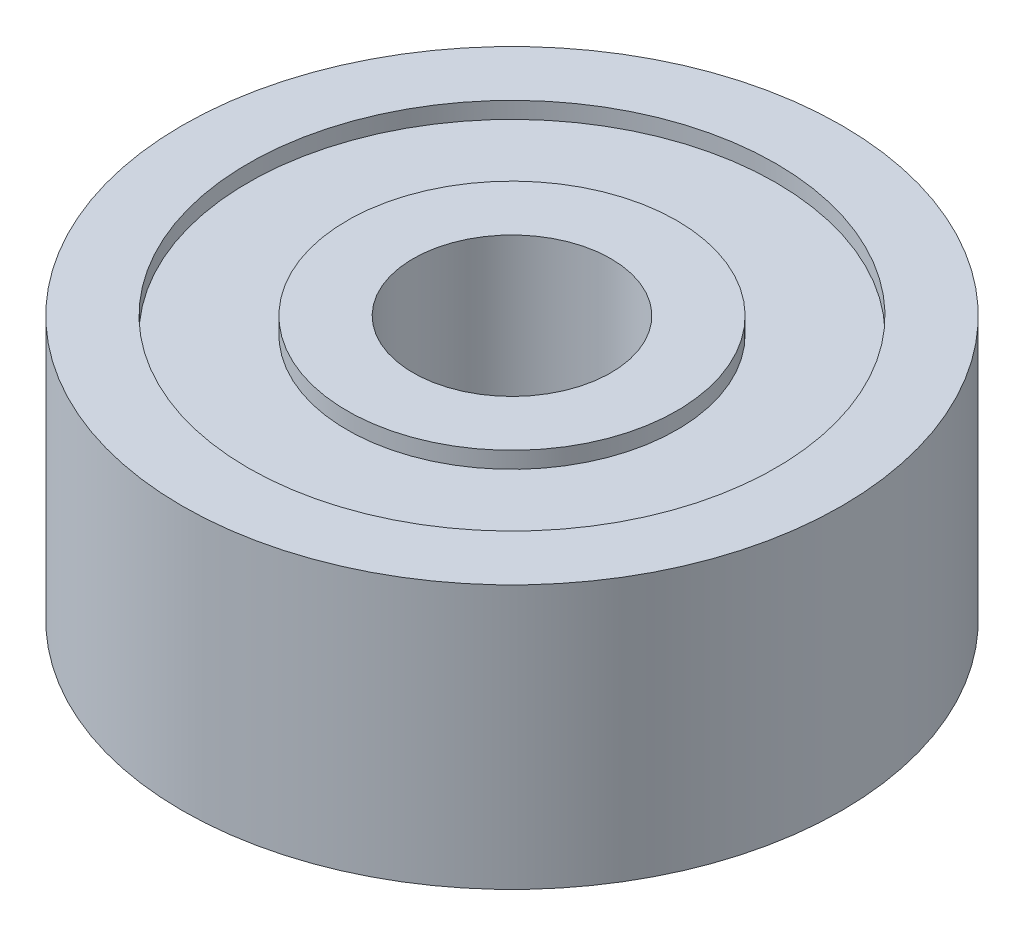
ISO-10303-21;
HEADER;
FILE_DESCRIPTION(('STEP AP214'),'2;1');
FILE_NAME('part.step','',(''),(''),'','','');
FILE_SCHEMA(('AUTOMOTIVE_DESIGN { 1 0 10303 214 1 1 1 1 }'));
ENDSEC;
DATA;
#1=APPLICATION_CONTEXT('core data for automotive mechanical design processes');
#2=APPLICATION_PROTOCOL_DEFINITION('international standard','automotive_design',2000,#1);
#3=PRODUCT_CONTEXT('',#1,'mechanical');
#4=PRODUCT('Part','Part','',(#3));
#5=PRODUCT_RELATED_PRODUCT_CATEGORY('part','',(#4));
#6=PRODUCT_DEFINITION_FORMATION('','',#4);
#7=PRODUCT_DEFINITION_CONTEXT('part definition',#1,'design');
#8=PRODUCT_DEFINITION('design','',#6,#7);
#9=PRODUCT_DEFINITION_SHAPE('','',#8);
#10=(LENGTH_UNIT() NAMED_UNIT(*) SI_UNIT(.MILLI.,.METRE.));
#11=(NAMED_UNIT(*) PLANE_ANGLE_UNIT() SI_UNIT($,.RADIAN.));
#12=(NAMED_UNIT(*) SI_UNIT($,.STERADIAN.) SOLID_ANGLE_UNIT());
#13=UNCERTAINTY_MEASURE_WITH_UNIT(LENGTH_MEASURE(1.E-05),#10,'distance_accuracy_value','');
#14=(GEOMETRIC_REPRESENTATION_CONTEXT(3) GLOBAL_UNCERTAINTY_ASSIGNED_CONTEXT((#13)) GLOBAL_UNIT_ASSIGNED_CONTEXT((#10,
#11,#12)) REPRESENTATION_CONTEXT('',''));
#15=CARTESIAN_POINT('',(0.,0.,0.));
#16=DIRECTION('',(0.,0.,1.));
#17=DIRECTION('',(1.,0.,0.));
#18=AXIS2_PLACEMENT_3D('',#15,#16,#17);
#19=CARTESIAN_POINT('',(1.5,0.,0.));
#20=DIRECTION('',(0.,-1.,0.));
#21=DIRECTION('',(0.,0.,-1.));
#22=AXIS2_PLACEMENT_3D('',#19,#20,#21);
#23=PLANE('',#22);
#24=CARTESIAN_POINT('',(0.,0.,0.));
#25=DIRECTION('',(0.,-1.,0.));
#26=DIRECTION('',(0.,0.,-1.));
#27=AXIS2_PLACEMENT_3D('',#24,#25,#26);
#28=CIRCLE('',#27,2.5);
#29=CARTESIAN_POINT('',(0.,0.,-2.5));
#30=VERTEX_POINT('',#29);
#31=EDGE_CURVE('E10',#30,#30,#28,.T.);
#32=ORIENTED_EDGE('',*,*,#31,.T.);
#33=EDGE_LOOP('',(#32));
#34=FACE_BOUND('',#33,.T.);
#35=CARTESIAN_POINT('',(0.,0.,0.));
#36=DIRECTION('',(0.,-1.,0.));
#37=DIRECTION('',(0.,0.,-1.));
#38=AXIS2_PLACEMENT_3D('',#35,#36,#37);
#39=CIRCLE('',#38,1.5);
#40=CARTESIAN_POINT('',(0.,0.,-1.5));
#41=VERTEX_POINT('',#40);
#42=EDGE_CURVE('E71',#41,#41,#39,.T.);
#43=ORIENTED_EDGE('',*,*,#42,.F.);
#44=EDGE_LOOP('',(#43));
#45=FACE_BOUND('',#44,.T.);
#46=ADVANCED_FACE('F31',(#34,#45),#23,.T.);
#47=CARTESIAN_POINT('',(0.,0.,0.));
#48=DIRECTION('',(0.,-1.,0.));
#49=DIRECTION('',(0.,0.,-1.));
#50=AXIS2_PLACEMENT_3D('',#47,#48,#49);
#51=CYLINDRICAL_SURFACE('',#50,2.5);
#52=CARTESIAN_POINT('',(0.,0.25,0.));
#53=DIRECTION('',(0.,-1.,0.));
#54=DIRECTION('',(0.,0.,-1.));
#55=AXIS2_PLACEMENT_3D('',#52,#53,#54);
#56=CIRCLE('',#55,2.5);
#57=CARTESIAN_POINT('',(0.,0.25,-2.5));
#58=VERTEX_POINT('',#57);
#59=EDGE_CURVE('E37',#58,#58,#56,.T.);
#60=ORIENTED_EDGE('',*,*,#59,.T.);
#61=EDGE_LOOP('',(#60));
#62=FACE_BOUND('',#61,.T.);
#63=ORIENTED_EDGE('',*,*,#31,.F.);
#64=EDGE_LOOP('',(#63));
#65=FACE_BOUND('',#64,.T.);
#66=ADVANCED_FACE('F79',(#62,#65),#51,.T.);
#67=CARTESIAN_POINT('',(2.5,0.25,0.));
#68=DIRECTION('',(0.,-1.,0.));
#69=DIRECTION('',(0.,0.,-1.));
#70=AXIS2_PLACEMENT_3D('',#67,#68,#69);
#71=PLANE('',#70);
#72=CARTESIAN_POINT('',(0.,0.25,0.));
#73=DIRECTION('',(0.,-1.,0.));
#74=DIRECTION('',(0.,0.,-1.));
#75=AXIS2_PLACEMENT_3D('',#72,#73,#74);
#76=CIRCLE('',#75,4.);
#77=CARTESIAN_POINT('',(0.,0.25,-4.));
#78=VERTEX_POINT('',#77);
#79=EDGE_CURVE('E41',#78,#78,#76,.T.);
#80=ORIENTED_EDGE('',*,*,#79,.T.);
#81=EDGE_LOOP('',(#80));
#82=FACE_BOUND('',#81,.T.);
#83=ORIENTED_EDGE('',*,*,#59,.F.);
#84=EDGE_LOOP('',(#83));
#85=FACE_BOUND('',#84,.T.);
#86=ADVANCED_FACE('F83',(#82,#85),#71,.T.);
#87=CARTESIAN_POINT('',(0.,0.,0.));
#88=DIRECTION('',(0.,-1.,0.));
#89=DIRECTION('',(0.,0.,-1.));
#90=AXIS2_PLACEMENT_3D('',#87,#88,#89);
#91=CYLINDRICAL_SURFACE('',#90,4.);
#92=CARTESIAN_POINT('',(0.,0.,0.));
#93=DIRECTION('',(0.,-1.,0.));
#94=DIRECTION('',(0.,0.,-1.));
#95=AXIS2_PLACEMENT_3D('',#92,#93,#94);
#96=CIRCLE('',#95,4.);
#97=CARTESIAN_POINT('',(0.,0.,-4.));
#98=VERTEX_POINT('',#97);
#99=EDGE_CURVE('E45',#98,#98,#96,.T.);
#100=ORIENTED_EDGE('',*,*,#99,.T.);
#101=EDGE_LOOP('',(#100));
#102=FACE_BOUND('',#101,.T.);
#103=ORIENTED_EDGE('',*,*,#79,.F.);
#104=EDGE_LOOP('',(#103));
#105=FACE_BOUND('',#104,.T.);
#106=ADVANCED_FACE('F87',(#102,#105),#91,.F.);
#107=CARTESIAN_POINT('',(4.,0.,0.));
#108=DIRECTION('',(0.,-1.,0.));
#109=DIRECTION('',(0.,0.,-1.));
#110=AXIS2_PLACEMENT_3D('',#107,#108,#109);
#111=PLANE('',#110);
#112=CARTESIAN_POINT('',(0.,0.,0.));
#113=DIRECTION('',(0.,-1.,0.));
#114=DIRECTION('',(0.,0.,-1.));
#115=AXIS2_PLACEMENT_3D('',#112,#113,#114);
#116=CIRCLE('',#115,5.);
#117=CARTESIAN_POINT('',(0.,0.,-5.));
#118=VERTEX_POINT('',#117);
#119=EDGE_CURVE('E50',#118,#118,#116,.T.);
#120=ORIENTED_EDGE('',*,*,#119,.T.);
#121=EDGE_LOOP('',(#120));
#122=FACE_BOUND('',#121,.T.);
#123=ORIENTED_EDGE('',*,*,#99,.F.);
#124=EDGE_LOOP('',(#123));
#125=FACE_BOUND('',#124,.T.);
#126=ADVANCED_FACE('F94',(#122,#125),#111,.T.);
#127=CARTESIAN_POINT('',(0.,0.,0.));
#128=DIRECTION('',(0.,-1.,0.));
#129=DIRECTION('',(0.,0.,-1.));
#130=AXIS2_PLACEMENT_3D('',#127,#128,#129);
#131=CYLINDRICAL_SURFACE('',#130,5.);
#132=CARTESIAN_POINT('',(0.,4.,0.));
#133=DIRECTION('',(0.,-1.,0.));
#134=DIRECTION('',(0.,0.,-1.));
#135=AXIS2_PLACEMENT_3D('',#132,#133,#134);
#136=CIRCLE('',#135,5.);
#137=CARTESIAN_POINT('',(0.,4.,-5.));
#138=VERTEX_POINT('',#137);
#139=EDGE_CURVE('E53',#138,#138,#136,.T.);
#140=ORIENTED_EDGE('',*,*,#139,.T.);
#141=EDGE_LOOP('',(#140));
#142=FACE_BOUND('',#141,.T.);
#143=ORIENTED_EDGE('',*,*,#119,.F.);
#144=EDGE_LOOP('',(#143));
#145=FACE_BOUND('',#144,.T.);
#146=ADVANCED_FACE('F98',(#142,#145),#131,.T.);
#147=CARTESIAN_POINT('',(4.,4.,0.));
#148=DIRECTION('',(0.,1.,0.));
#149=DIRECTION('',(0.,0.,1.));
#150=AXIS2_PLACEMENT_3D('',#147,#148,#149);
#151=PLANE('',#150);
#152=CARTESIAN_POINT('',(0.,4.,0.));
#153=DIRECTION('',(0.,-1.,0.));
#154=DIRECTION('',(0.,0.,-1.));
#155=AXIS2_PLACEMENT_3D('',#152,#153,#154);
#156=CIRCLE('',#155,4.);
#157=CARTESIAN_POINT('',(0.,4.,-4.));
#158=VERTEX_POINT('',#157);
#159=EDGE_CURVE('E56',#158,#158,#156,.T.);
#160=ORIENTED_EDGE('',*,*,#159,.T.);
#161=EDGE_LOOP('',(#160));
#162=FACE_BOUND('',#161,.T.);
#163=ORIENTED_EDGE('',*,*,#139,.F.);
#164=EDGE_LOOP('',(#163));
#165=FACE_BOUND('',#164,.T.);
#166=ADVANCED_FACE('F102',(#162,#165),#151,.T.);
#167=CARTESIAN_POINT('',(0.,0.,0.));
#168=DIRECTION('',(0.,-1.,0.));
#169=DIRECTION('',(0.,0.,-1.));
#170=AXIS2_PLACEMENT_3D('',#167,#168,#169);
#171=CYLINDRICAL_SURFACE('',#170,4.);
#172=CARTESIAN_POINT('',(0.,3.75,0.));
#173=DIRECTION('',(0.,-1.,0.));
#174=DIRECTION('',(0.,0.,-1.));
#175=AXIS2_PLACEMENT_3D('',#172,#173,#174);
#176=CIRCLE('',#175,4.);
#177=CARTESIAN_POINT('',(0.,3.75,-4.));
#178=VERTEX_POINT('',#177);
#179=EDGE_CURVE('E59',#178,#178,#176,.T.);
#180=ORIENTED_EDGE('',*,*,#179,.T.);
#181=EDGE_LOOP('',(#180));
#182=FACE_BOUND('',#181,.T.);
#183=ORIENTED_EDGE('',*,*,#159,.F.);
#184=EDGE_LOOP('',(#183));
#185=FACE_BOUND('',#184,.T.);
#186=ADVANCED_FACE('F106',(#182,#185),#171,.F.);
#187=CARTESIAN_POINT('',(2.5,3.75,0.));
#188=DIRECTION('',(0.,1.,0.));
#189=DIRECTION('',(0.,0.,1.));
#190=AXIS2_PLACEMENT_3D('',#187,#188,#189);
#191=PLANE('',#190);
#192=CARTESIAN_POINT('',(0.,3.75,0.));
#193=DIRECTION('',(0.,-1.,0.));
#194=DIRECTION('',(0.,0.,-1.));
#195=AXIS2_PLACEMENT_3D('',#192,#193,#194);
#196=CIRCLE('',#195,2.5);
#197=CARTESIAN_POINT('',(0.,3.75,-2.5));
#198=VERTEX_POINT('',#197);
#199=EDGE_CURVE('E62',#198,#198,#196,.T.);
#200=ORIENTED_EDGE('',*,*,#199,.T.);
#201=EDGE_LOOP('',(#200));
#202=FACE_BOUND('',#201,.T.);
#203=ORIENTED_EDGE('',*,*,#179,.F.);
#204=EDGE_LOOP('',(#203));
#205=FACE_BOUND('',#204,.T.);
#206=ADVANCED_FACE('F110',(#202,#205),#191,.T.);
#207=CARTESIAN_POINT('',(0.,0.,0.));
#208=DIRECTION('',(0.,-1.,0.));
#209=DIRECTION('',(0.,0.,-1.));
#210=AXIS2_PLACEMENT_3D('',#207,#208,#209);
#211=CYLINDRICAL_SURFACE('',#210,2.5);
#212=CARTESIAN_POINT('',(0.,4.,0.));
#213=DIRECTION('',(0.,-1.,0.));
#214=DIRECTION('',(0.,0.,-1.));
#215=AXIS2_PLACEMENT_3D('',#212,#213,#214);
#216=CIRCLE('',#215,2.5);
#217=CARTESIAN_POINT('',(0.,4.,-2.5));
#218=VERTEX_POINT('',#217);
#219=EDGE_CURVE('E65',#218,#218,#216,.T.);
#220=ORIENTED_EDGE('',*,*,#219,.T.);
#221=EDGE_LOOP('',(#220));
#222=FACE_BOUND('',#221,.T.);
#223=ORIENTED_EDGE('',*,*,#199,.F.);
#224=EDGE_LOOP('',(#223));
#225=FACE_BOUND('',#224,.T.);
#226=ADVANCED_FACE('F114',(#222,#225),#211,.T.);
#227=CARTESIAN_POINT('',(1.5,4.,0.));
#228=DIRECTION('',(0.,1.,0.));
#229=DIRECTION('',(0.,0.,1.));
#230=AXIS2_PLACEMENT_3D('',#227,#228,#229);
#231=PLANE('',#230);
#232=CARTESIAN_POINT('',(0.,4.,0.));
#233=DIRECTION('',(0.,-1.,0.));
#234=DIRECTION('',(0.,0.,-1.));
#235=AXIS2_PLACEMENT_3D('',#232,#233,#234);
#236=CIRCLE('',#235,1.5);
#237=CARTESIAN_POINT('',(0.,4.,-1.5));
#238=VERTEX_POINT('',#237);
#239=EDGE_CURVE('E68',#238,#238,#236,.T.);
#240=ORIENTED_EDGE('',*,*,#239,.T.);
#241=EDGE_LOOP('',(#240));
#242=FACE_BOUND('',#241,.T.);
#243=ORIENTED_EDGE('',*,*,#219,.F.);
#244=EDGE_LOOP('',(#243));
#245=FACE_BOUND('',#244,.T.);
#246=ADVANCED_FACE('F118',(#242,#245),#231,.T.);
#247=CARTESIAN_POINT('',(0.,0.,0.));
#248=DIRECTION('',(0.,-1.,0.));
#249=DIRECTION('',(0.,0.,-1.));
#250=AXIS2_PLACEMENT_3D('',#247,#248,#249);
#251=CYLINDRICAL_SURFACE('',#250,1.5);
#252=ORIENTED_EDGE('',*,*,#42,.T.);
#253=EDGE_LOOP('',(#252));
#254=FACE_BOUND('',#253,.T.);
#255=ORIENTED_EDGE('',*,*,#239,.F.);
#256=EDGE_LOOP('',(#255));
#257=FACE_BOUND('',#256,.T.);
#258=ADVANCED_FACE('F75',(#254,#257),#251,.F.);
#259=CLOSED_SHELL('',(#46,#66,#86,#106,#126,#146,#166,#186,#206,#226,#246,#258));
#260=MANIFOLD_SOLID_BREP('B2',#259);
#261=ADVANCED_BREP_SHAPE_REPRESENTATION('',(#18,#260),#14);
#262=SHAPE_DEFINITION_REPRESENTATION(#9,#261);
ENDSEC;
END-ISO-10303-21;
